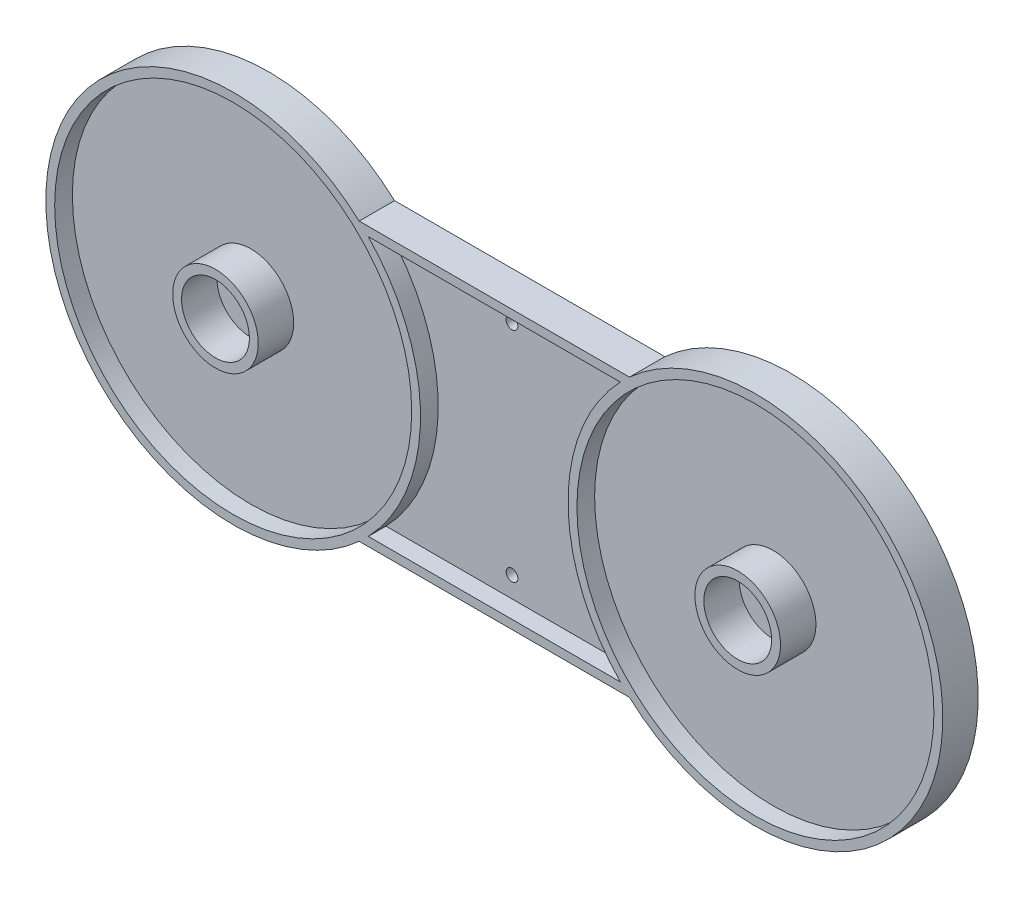
ISO-10303-21;
HEADER;
FILE_DESCRIPTION(('STEP AP214'),'2;1');
FILE_NAME('part.step','',(''),(''),'','','');
FILE_SCHEMA(('AUTOMOTIVE_DESIGN { 1 0 10303 214 1 1 1 1 }'));
ENDSEC;
DATA;
#1=APPLICATION_CONTEXT('core data for automotive mechanical design processes');
#2=APPLICATION_PROTOCOL_DEFINITION('international standard','automotive_design',2000,#1);
#3=PRODUCT_CONTEXT('',#1,'mechanical');
#4=PRODUCT('Part','Part','',(#3));
#5=PRODUCT_RELATED_PRODUCT_CATEGORY('part','',(#4));
#6=PRODUCT_DEFINITION_FORMATION('','',#4);
#7=PRODUCT_DEFINITION_CONTEXT('part definition',#1,'design');
#8=PRODUCT_DEFINITION('design','',#6,#7);
#9=PRODUCT_DEFINITION_SHAPE('','',#8);
#10=(LENGTH_UNIT() NAMED_UNIT(*) SI_UNIT(.MILLI.,.METRE.));
#11=(NAMED_UNIT(*) PLANE_ANGLE_UNIT() SI_UNIT($,.RADIAN.));
#12=(NAMED_UNIT(*) SI_UNIT($,.STERADIAN.) SOLID_ANGLE_UNIT());
#13=UNCERTAINTY_MEASURE_WITH_UNIT(LENGTH_MEASURE(1.E-05),#10,'distance_accuracy_value','');
#14=(GEOMETRIC_REPRESENTATION_CONTEXT(3) GLOBAL_UNCERTAINTY_ASSIGNED_CONTEXT((#13)) GLOBAL_UNIT_ASSIGNED_CONTEXT((#10,
#11,#12)) REPRESENTATION_CONTEXT('',''));
#15=CARTESIAN_POINT('',(0.,0.,0.));
#16=DIRECTION('',(0.,0.,1.));
#17=DIRECTION('',(1.,0.,0.));
#18=AXIS2_PLACEMENT_3D('',#15,#16,#17);
#19=CARTESIAN_POINT('',(44.25,0.,3.));
#20=DIRECTION('',(0.,0.,1.));
#21=DIRECTION('',(1.,0.,0.));
#22=AXIS2_PLACEMENT_3D('',#19,#20,#21);
#23=PLANE('',#22);
#24=DIRECTION('',(-1.,0.,0.));
#25=VECTOR('',#24,1.);
#26=CARTESIAN_POINT('',(0.,22.,3.));
#27=LINE('',#26,#25);
#28=CARTESIAN_POINT('',(21.3575885935972,22.,3.));
#29=VERTEX_POINT('',#28);
#30=CARTESIAN_POINT('',(-21.3575885935972,22.,3.));
#31=VERTEX_POINT('',#30);
#32=EDGE_CURVE('E57',#29,#31,#27,.T.);
#33=ORIENTED_EDGE('',*,*,#32,.T.);
#34=CARTESIAN_POINT('',(-44.25,0.,3.));
#35=DIRECTION('',(0.,0.,1.));
#36=DIRECTION('',(1.,0.,0.));
#37=AXIS2_PLACEMENT_3D('',#34,#35,#36);
#38=CIRCLE('',#37,31.75);
#39=CARTESIAN_POINT('',(-21.3575885935972,-22.,3.));
#40=VERTEX_POINT('',#39);
#41=EDGE_CURVE('E169',#40,#31,#38,.T.);
#42=ORIENTED_EDGE('',*,*,#41,.F.);
#43=DIRECTION('',(1.,0.,0.));
#44=VECTOR('',#43,1.);
#45=CARTESIAN_POINT('',(0.,-22.,3.));
#46=LINE('',#45,#44);
#47=CARTESIAN_POINT('',(21.3575885935972,-22.,3.));
#48=VERTEX_POINT('',#47);
#49=EDGE_CURVE('E137',#40,#48,#46,.T.);
#50=ORIENTED_EDGE('',*,*,#49,.T.);
#51=CARTESIAN_POINT('',(44.25,0.,3.));
#52=DIRECTION('',(0.,0.,1.));
#53=DIRECTION('',(1.,0.,0.));
#54=AXIS2_PLACEMENT_3D('',#51,#52,#53);
#55=CIRCLE('',#54,31.75);
#56=EDGE_CURVE('E62',#29,#48,#55,.T.);
#57=ORIENTED_EDGE('',*,*,#56,.F.);
#58=EDGE_LOOP('',(#33,#42,#50,#57));
#59=FACE_BOUND('',#58,.T.);
#60=CARTESIAN_POINT('',(0.,-18.5,3.));
#61=DIRECTION('',(0.,0.,1.));
#62=DIRECTION('',(1.,0.,0.));
#63=AXIS2_PLACEMENT_3D('',#60,#61,#62);
#64=CIRCLE('',#63,1.);
#65=CARTESIAN_POINT('',(1.,-18.5,3.));
#66=VERTEX_POINT('',#65);
#67=EDGE_CURVE('E198',#66,#66,#64,.T.);
#68=ORIENTED_EDGE('',*,*,#67,.F.);
#69=EDGE_LOOP('',(#68));
#70=FACE_BOUND('',#69,.T.);
#71=CARTESIAN_POINT('',(0.,18.5,3.));
#72=DIRECTION('',(0.,0.,1.));
#73=DIRECTION('',(-1.,0.,0.));
#74=AXIS2_PLACEMENT_3D('',#71,#72,#73);
#75=CIRCLE('',#74,1.);
#76=CARTESIAN_POINT('',(-0.999999999999998,18.5,3.));
#77=VERTEX_POINT('',#76);
#78=EDGE_CURVE('E190',#77,#77,#75,.T.);
#79=ORIENTED_EDGE('',*,*,#78,.F.);
#80=EDGE_LOOP('',(#79));
#81=FACE_BOUND('',#80,.T.);
#82=ADVANCED_FACE('F41',(#59,#70,#81),#23,.T.);
#83=CARTESIAN_POINT('',(44.25,0.,0.));
#84=DIRECTION('',(0.,0.,1.));
#85=DIRECTION('',(1.,0.,0.));
#86=AXIS2_PLACEMENT_3D('',#83,#84,#85);
#87=PLANE('',#86);
#88=CARTESIAN_POINT('',(44.25,0.,0.));
#89=DIRECTION('',(0.,0.,1.));
#90=DIRECTION('',(1.,0.,0.));
#91=AXIS2_PLACEMENT_3D('',#88,#89,#90);
#92=CIRCLE('',#91,31.75);
#93=CARTESIAN_POINT('',(22.9002341933219,-23.5,0.));
#94=VERTEX_POINT('',#93);
#95=CARTESIAN_POINT('',(22.9002341933219,23.5,0.));
#96=VERTEX_POINT('',#95);
#97=EDGE_CURVE('E202',#94,#96,#92,.T.);
#98=ORIENTED_EDGE('',*,*,#97,.F.);
#99=DIRECTION('',(1.,0.,0.));
#100=VECTOR('',#99,1.);
#101=CARTESIAN_POINT('',(-22.9002341933219,-23.5,0.));
#102=LINE('',#101,#100);
#103=CARTESIAN_POINT('',(-22.9002341933219,-23.5,0.));
#104=VERTEX_POINT('',#103);
#105=EDGE_CURVE('E113',#104,#94,#102,.T.);
#106=ORIENTED_EDGE('',*,*,#105,.F.);
#107=CARTESIAN_POINT('',(-44.25,0.,0.));
#108=DIRECTION('',(0.,0.,1.));
#109=DIRECTION('',(1.,0.,0.));
#110=AXIS2_PLACEMENT_3D('',#107,#108,#109);
#111=CIRCLE('',#110,31.75);
#112=CARTESIAN_POINT('',(-22.9002341933219,23.5,0.));
#113=VERTEX_POINT('',#112);
#114=EDGE_CURVE('E211',#113,#104,#111,.T.);
#115=ORIENTED_EDGE('',*,*,#114,.F.);
#116=DIRECTION('',(-1.,0.,0.));
#117=VECTOR('',#116,1.);
#118=CARTESIAN_POINT('',(-22.9002341933219,23.5,0.));
#119=LINE('',#118,#117);
#120=EDGE_CURVE('E208',#96,#113,#119,.T.);
#121=ORIENTED_EDGE('',*,*,#120,.F.);
#122=EDGE_LOOP('',(#98,#106,#115,#121));
#123=FACE_BOUND('',#122,.T.);
#124=CARTESIAN_POINT('',(0.,-18.5,0.));
#125=DIRECTION('',(0.,0.,1.));
#126=DIRECTION('',(1.,0.,0.));
#127=AXIS2_PLACEMENT_3D('',#124,#125,#126);
#128=CIRCLE('',#127,1.);
#129=CARTESIAN_POINT('',(1.,-18.5,0.));
#130=VERTEX_POINT('',#129);
#131=EDGE_CURVE('E194',#130,#130,#128,.T.);
#132=ORIENTED_EDGE('',*,*,#131,.T.);
#133=EDGE_LOOP('',(#132));
#134=FACE_BOUND('',#133,.T.);
#135=CARTESIAN_POINT('',(0.,18.5,0.));
#136=DIRECTION('',(0.,0.,1.));
#137=DIRECTION('',(-1.,0.,0.));
#138=AXIS2_PLACEMENT_3D('',#135,#136,#137);
#139=CIRCLE('',#138,1.);
#140=CARTESIAN_POINT('',(-0.999999999999998,18.5,0.));
#141=VERTEX_POINT('',#140);
#142=EDGE_CURVE('E189',#141,#141,#139,.T.);
#143=ORIENTED_EDGE('',*,*,#142,.T.);
#144=EDGE_LOOP('',(#143));
#145=FACE_BOUND('',#144,.T.);
#146=ADVANCED_FACE('F263',(#123,#134,#145),#87,.F.);
#147=CARTESIAN_POINT('',(44.25,0.,3.));
#148=DIRECTION('',(0.,0.,-1.));
#149=DIRECTION('',(-1.,0.,0.));
#150=AXIS2_PLACEMENT_3D('',#147,#148,#149);
#151=CYLINDRICAL_SURFACE('',#150,31.75);
#152=ORIENTED_EDGE('',*,*,#97,.T.);
#153=DIRECTION('',(0.,0.,-1.));
#154=VECTOR('',#153,1.);
#155=CARTESIAN_POINT('',(22.9002341933219,23.5,3.));
#156=LINE('',#155,#154);
#157=CARTESIAN_POINT('',(22.9002341933219,23.5,6.));
#158=VERTEX_POINT('',#157);
#159=EDGE_CURVE('E123',#158,#96,#156,.T.);
#160=ORIENTED_EDGE('',*,*,#159,.F.);
#161=CARTESIAN_POINT('',(44.25,0.,6.));
#162=DIRECTION('',(0.,0.,1.));
#163=DIRECTION('',(1.,0.,0.));
#164=AXIS2_PLACEMENT_3D('',#161,#162,#163);
#165=CIRCLE('',#164,31.75);
#166=CARTESIAN_POINT('',(22.9002341933219,-23.5,6.));
#167=VERTEX_POINT('',#166);
#168=EDGE_CURVE('E121',#167,#158,#165,.T.);
#169=ORIENTED_EDGE('',*,*,#168,.F.);
#170=DIRECTION('',(0.,0.,-1.));
#171=VECTOR('',#170,1.);
#172=CARTESIAN_POINT('',(22.9002341933219,-23.5,3.));
#173=LINE('',#172,#171);
#174=EDGE_CURVE('E106',#167,#94,#173,.T.);
#175=ORIENTED_EDGE('',*,*,#174,.T.);
#176=EDGE_LOOP('',(#152,#160,#169,#175));
#177=FACE_BOUND('',#176,.T.);
#178=ADVANCED_FACE('F43',(#177),#151,.T.);
#179=CARTESIAN_POINT('',(-22.9002341933219,23.5,3.));
#180=DIRECTION('',(0.,-1.,0.));
#181=DIRECTION('',(1.,0.,0.));
#182=AXIS2_PLACEMENT_3D('',#179,#180,#181);
#183=PLANE('',#182);
#184=ORIENTED_EDGE('',*,*,#120,.T.);
#185=DIRECTION('',(0.,0.,-1.));
#186=VECTOR('',#185,1.);
#187=CARTESIAN_POINT('',(-22.9002341933219,23.5,3.));
#188=LINE('',#187,#186);
#189=CARTESIAN_POINT('',(-22.9002341933219,23.5,6.));
#190=VERTEX_POINT('',#189);
#191=EDGE_CURVE('E218',#190,#113,#188,.T.);
#192=ORIENTED_EDGE('',*,*,#191,.F.);
#193=DIRECTION('',(-1.,0.,0.));
#194=VECTOR('',#193,1.);
#195=CARTESIAN_POINT('',(0.,23.5,6.));
#196=LINE('',#195,#194);
#197=EDGE_CURVE('E128',#158,#190,#196,.T.);
#198=ORIENTED_EDGE('',*,*,#197,.F.);
#199=ORIENTED_EDGE('',*,*,#159,.T.);
#200=EDGE_LOOP('',(#184,#192,#198,#199));
#201=FACE_BOUND('',#200,.T.);
#202=ADVANCED_FACE('F332',(#201),#183,.F.);
#203=CARTESIAN_POINT('',(-44.25,0.,3.));
#204=DIRECTION('',(0.,0.,-1.));
#205=DIRECTION('',(-1.,0.,0.));
#206=AXIS2_PLACEMENT_3D('',#203,#204,#205);
#207=CYLINDRICAL_SURFACE('',#206,31.75);
#208=ORIENTED_EDGE('',*,*,#114,.T.);
#209=DIRECTION('',(0.,0.,-1.));
#210=VECTOR('',#209,1.);
#211=CARTESIAN_POINT('',(-22.9002341933219,-23.5,3.));
#212=LINE('',#211,#210);
#213=CARTESIAN_POINT('',(-22.9002341933219,-23.5,6.));
#214=VERTEX_POINT('',#213);
#215=EDGE_CURVE('E118',#214,#104,#212,.T.);
#216=ORIENTED_EDGE('',*,*,#215,.F.);
#217=CARTESIAN_POINT('',(-44.25,0.,6.));
#218=DIRECTION('',(0.,0.,1.));
#219=DIRECTION('',(1.,0.,0.));
#220=AXIS2_PLACEMENT_3D('',#217,#218,#219);
#221=CIRCLE('',#220,31.75);
#222=EDGE_CURVE('E135',#190,#214,#221,.T.);
#223=ORIENTED_EDGE('',*,*,#222,.F.);
#224=ORIENTED_EDGE('',*,*,#191,.T.);
#225=EDGE_LOOP('',(#208,#216,#223,#224));
#226=FACE_BOUND('',#225,.T.);
#227=ADVANCED_FACE('F318',(#226),#207,.T.);
#228=CARTESIAN_POINT('',(-22.9002341933219,-23.5,3.));
#229=DIRECTION('',(0.,1.,0.));
#230=DIRECTION('',(-1.,0.,0.));
#231=AXIS2_PLACEMENT_3D('',#228,#229,#230);
#232=PLANE('',#231);
#233=ORIENTED_EDGE('',*,*,#105,.T.);
#234=ORIENTED_EDGE('',*,*,#174,.F.);
#235=DIRECTION('',(1.,0.,0.));
#236=VECTOR('',#235,1.);
#237=CARTESIAN_POINT('',(0.,-23.5,6.));
#238=LINE('',#237,#236);
#239=EDGE_CURVE('E111',#214,#167,#238,.T.);
#240=ORIENTED_EDGE('',*,*,#239,.F.);
#241=ORIENTED_EDGE('',*,*,#215,.T.);
#242=EDGE_LOOP('',(#233,#234,#240,#241));
#243=FACE_BOUND('',#242,.T.);
#244=ADVANCED_FACE('F108',(#243),#232,.F.);
#245=CARTESIAN_POINT('',(0.,-18.5,3.));
#246=DIRECTION('',(0.,0.,-1.));
#247=DIRECTION('',(-1.,0.,0.));
#248=AXIS2_PLACEMENT_3D('',#245,#246,#247);
#249=CYLINDRICAL_SURFACE('',#248,1.);
#250=ORIENTED_EDGE('',*,*,#67,.T.);
#251=EDGE_LOOP('',(#250));
#252=FACE_BOUND('',#251,.T.);
#253=ORIENTED_EDGE('',*,*,#131,.F.);
#254=EDGE_LOOP('',(#253));
#255=FACE_BOUND('',#254,.T.);
#256=ADVANCED_FACE('F311',(#252,#255),#249,.F.);
#257=CARTESIAN_POINT('',(0.,18.5,3.));
#258=DIRECTION('',(0.,0.,-1.));
#259=DIRECTION('',(-1.,0.,0.));
#260=AXIS2_PLACEMENT_3D('',#257,#258,#259);
#261=CYLINDRICAL_SURFACE('',#260,1.);
#262=ORIENTED_EDGE('',*,*,#78,.T.);
#263=EDGE_LOOP('',(#262));
#264=FACE_BOUND('',#263,.T.);
#265=ORIENTED_EDGE('',*,*,#142,.F.);
#266=EDGE_LOOP('',(#265));
#267=FACE_BOUND('',#266,.T.);
#268=ADVANCED_FACE('F307',(#264,#267),#261,.F.);
#269=CARTESIAN_POINT('',(-44.25,0.,6.));
#270=DIRECTION('',(0.,0.,-1.));
#271=DIRECTION('',(-1.,0.,0.));
#272=AXIS2_PLACEMENT_3D('',#269,#270,#271);
#273=CYLINDRICAL_SURFACE('',#272,31.75);
#274=ORIENTED_EDGE('',*,*,#41,.T.);
#275=DIRECTION('',(0.,0.,-1.));
#276=VECTOR('',#275,1.);
#277=CARTESIAN_POINT('',(-21.3575885935972,22.,6.));
#278=LINE('',#277,#276);
#279=CARTESIAN_POINT('',(-21.3575885935972,22.,6.));
#280=VERTEX_POINT('',#279);
#281=EDGE_CURVE('E186',#280,#31,#278,.T.);
#282=ORIENTED_EDGE('',*,*,#281,.F.);
#283=CARTESIAN_POINT('',(-21.3575885935972,-22.,6.));
#284=VERTEX_POINT('',#283);
#285=EDGE_CURVE('E150',#284,#280,#221,.T.);
#286=ORIENTED_EDGE('',*,*,#285,.F.);
#287=DIRECTION('',(0.,0.,-1.));
#288=VECTOR('',#287,1.);
#289=CARTESIAN_POINT('',(-21.3575885935972,-22.,6.));
#290=LINE('',#289,#288);
#291=EDGE_CURVE('E166',#284,#40,#290,.T.);
#292=ORIENTED_EDGE('',*,*,#291,.T.);
#293=EDGE_LOOP('',(#274,#282,#286,#292));
#294=FACE_BOUND('',#293,.T.);
#295=ADVANCED_FACE('F304',(#294),#273,.T.);
#296=CARTESIAN_POINT('',(0.,22.,6.));
#297=DIRECTION('',(0.,-1.,0.));
#298=DIRECTION('',(0.,0.,-1.));
#299=AXIS2_PLACEMENT_3D('',#296,#297,#298);
#300=PLANE('',#299);
#301=ORIENTED_EDGE('',*,*,#32,.F.);
#302=DIRECTION('',(0.,0.,-1.));
#303=VECTOR('',#302,1.);
#304=CARTESIAN_POINT('',(21.3575885935972,22.,6.));
#305=LINE('',#304,#303);
#306=CARTESIAN_POINT('',(21.3575885935972,22.,6.));
#307=VERTEX_POINT('',#306);
#308=EDGE_CURVE('E183',#307,#29,#305,.T.);
#309=ORIENTED_EDGE('',*,*,#308,.F.);
#310=DIRECTION('',(-1.,0.,0.));
#311=VECTOR('',#310,1.);
#312=CARTESIAN_POINT('',(0.,22.,6.));
#313=LINE('',#312,#311);
#314=EDGE_CURVE('E154',#307,#280,#313,.T.);
#315=ORIENTED_EDGE('',*,*,#314,.T.);
#316=ORIENTED_EDGE('',*,*,#281,.T.);
#317=EDGE_LOOP('',(#301,#309,#315,#316));
#318=FACE_BOUND('',#317,.T.);
#319=ADVANCED_FACE('F300',(#318),#300,.T.);
#320=CARTESIAN_POINT('',(44.25,0.,6.));
#321=DIRECTION('',(0.,0.,-1.));
#322=DIRECTION('',(-1.,0.,0.));
#323=AXIS2_PLACEMENT_3D('',#320,#321,#322);
#324=CYLINDRICAL_SURFACE('',#323,31.75);
#325=ORIENTED_EDGE('',*,*,#56,.T.);
#326=DIRECTION('',(0.,0.,-1.));
#327=VECTOR('',#326,1.);
#328=CARTESIAN_POINT('',(21.3575885935972,-22.,6.));
#329=LINE('',#328,#327);
#330=CARTESIAN_POINT('',(21.3575885935972,-22.,6.));
#331=VERTEX_POINT('',#330);
#332=EDGE_CURVE('E179',#331,#48,#329,.T.);
#333=ORIENTED_EDGE('',*,*,#332,.F.);
#334=EDGE_CURVE('E130',#307,#331,#165,.T.);
#335=ORIENTED_EDGE('',*,*,#334,.F.);
#336=ORIENTED_EDGE('',*,*,#308,.T.);
#337=EDGE_LOOP('',(#325,#333,#335,#336));
#338=FACE_BOUND('',#337,.T.);
#339=ADVANCED_FACE('F296',(#338),#324,.T.);
#340=CARTESIAN_POINT('',(0.,-22.,6.));
#341=DIRECTION('',(0.,1.,0.));
#342=DIRECTION('',(0.,0.,1.));
#343=AXIS2_PLACEMENT_3D('',#340,#341,#342);
#344=PLANE('',#343);
#345=ORIENTED_EDGE('',*,*,#49,.F.);
#346=ORIENTED_EDGE('',*,*,#291,.F.);
#347=DIRECTION('',(1.,0.,0.));
#348=VECTOR('',#347,1.);
#349=CARTESIAN_POINT('',(0.,-22.,6.));
#350=LINE('',#349,#348);
#351=EDGE_CURVE('E158',#284,#331,#350,.T.);
#352=ORIENTED_EDGE('',*,*,#351,.T.);
#353=ORIENTED_EDGE('',*,*,#332,.T.);
#354=EDGE_LOOP('',(#345,#346,#352,#353));
#355=FACE_BOUND('',#354,.T.);
#356=ADVANCED_FACE('F289',(#355),#344,.T.);
#357=CARTESIAN_POINT('',(-44.25,0.,6.));
#358=DIRECTION('',(0.,0.,-1.));
#359=DIRECTION('',(-1.,0.,0.));
#360=AXIS2_PLACEMENT_3D('',#357,#358,#359);
#361=CYLINDRICAL_SURFACE('',#360,30.25);
#362=CARTESIAN_POINT('',(-44.25,0.,6.));
#363=DIRECTION('',(0.,0.,1.));
#364=DIRECTION('',(1.,0.,0.));
#365=AXIS2_PLACEMENT_3D('',#362,#363,#364);
#366=CIRCLE('',#365,30.25);
#367=CARTESIAN_POINT('',(-14.,0.,6.));
#368=VERTEX_POINT('',#367);
#369=EDGE_CURVE('E149',#368,#368,#366,.T.);
#370=ORIENTED_EDGE('',*,*,#369,.T.);
#371=EDGE_LOOP('',(#370));
#372=FACE_BOUND('',#371,.T.);
#373=CARTESIAN_POINT('',(-44.25,0.,3.));
#374=DIRECTION('',(0.,0.,1.));
#375=DIRECTION('',(1.,0.,0.));
#376=AXIS2_PLACEMENT_3D('',#373,#374,#375);
#377=CIRCLE('',#376,30.25);
#378=CARTESIAN_POINT('',(-14.,0.,3.));
#379=VERTEX_POINT('',#378);
#380=EDGE_CURVE('E228',#379,#379,#377,.F.);
#381=ORIENTED_EDGE('',*,*,#380,.T.);
#382=EDGE_LOOP('',(#381));
#383=FACE_BOUND('',#382,.T.);
#384=ADVANCED_FACE('F283',(#372,#383),#361,.F.);
#385=CARTESIAN_POINT('',(44.25,0.,6.));
#386=DIRECTION('',(0.,0.,-1.));
#387=DIRECTION('',(-1.,0.,0.));
#388=AXIS2_PLACEMENT_3D('',#385,#386,#387);
#389=CYLINDRICAL_SURFACE('',#388,30.25);
#390=CARTESIAN_POINT('',(44.25,0.,6.));
#391=DIRECTION('',(0.,0.,1.));
#392=DIRECTION('',(1.,0.,0.));
#393=AXIS2_PLACEMENT_3D('',#390,#391,#392);
#394=CIRCLE('',#393,30.25);
#395=CARTESIAN_POINT('',(74.5,0.,6.));
#396=VERTEX_POINT('',#395);
#397=EDGE_CURVE('E162',#396,#396,#394,.T.);
#398=ORIENTED_EDGE('',*,*,#397,.T.);
#399=EDGE_LOOP('',(#398));
#400=FACE_BOUND('',#399,.T.);
#401=CARTESIAN_POINT('',(44.25,0.,3.));
#402=DIRECTION('',(0.,0.,1.));
#403=DIRECTION('',(1.,0.,0.));
#404=AXIS2_PLACEMENT_3D('',#401,#402,#403);
#405=CIRCLE('',#404,30.25);
#406=CARTESIAN_POINT('',(74.5,0.,3.));
#407=VERTEX_POINT('',#406);
#408=EDGE_CURVE('E224',#407,#407,#405,.F.);
#409=ORIENTED_EDGE('',*,*,#408,.T.);
#410=EDGE_LOOP('',(#409));
#411=FACE_BOUND('',#410,.T.);
#412=ADVANCED_FACE('F274',(#400,#411),#389,.F.);
#413=CARTESIAN_POINT('',(0.,0.,6.));
#414=DIRECTION('',(0.,0.,1.));
#415=DIRECTION('',(1.,0.,0.));
#416=AXIS2_PLACEMENT_3D('',#413,#414,#415);
#417=PLANE('',#416);
#418=ORIENTED_EDGE('',*,*,#239,.T.);
#419=ORIENTED_EDGE('',*,*,#168,.T.);
#420=ORIENTED_EDGE('',*,*,#197,.T.);
#421=ORIENTED_EDGE('',*,*,#222,.T.);
#422=EDGE_LOOP('',(#418,#419,#420,#421));
#423=FACE_BOUND('',#422,.T.);
#424=ORIENTED_EDGE('',*,*,#369,.F.);
#425=EDGE_LOOP('',(#424));
#426=FACE_BOUND('',#425,.T.);
#427=ORIENTED_EDGE('',*,*,#285,.T.);
#428=ORIENTED_EDGE('',*,*,#314,.F.);
#429=ORIENTED_EDGE('',*,*,#334,.T.);
#430=ORIENTED_EDGE('',*,*,#351,.F.);
#431=EDGE_LOOP('',(#427,#428,#429,#430));
#432=FACE_BOUND('',#431,.T.);
#433=ORIENTED_EDGE('',*,*,#397,.F.);
#434=EDGE_LOOP('',(#433));
#435=FACE_BOUND('',#434,.T.);
#436=ADVANCED_FACE('F132',(#423,#426,#432,#435),#417,.T.);
#437=CARTESIAN_POINT('',(44.25,0.,3.));
#438=DIRECTION('',(0.,0.,1.));
#439=DIRECTION('',(-1.,0.,0.));
#440=AXIS2_PLACEMENT_3D('',#437,#438,#439);
#441=CIRCLE('',#440,7.25);
#442=CARTESIAN_POINT('',(37.,0.,3.));
#443=VERTEX_POINT('',#442);
#444=EDGE_CURVE('E279',#443,#443,#441,.T.);
#445=ORIENTED_EDGE('',*,*,#444,.F.);
#446=EDGE_LOOP('',(#445));
#447=FACE_BOUND('',#446,.T.);
#448=ORIENTED_EDGE('',*,*,#408,.F.);
#449=EDGE_LOOP('',(#448));
#450=FACE_BOUND('',#449,.T.);
#451=ADVANCED_FACE('F257',(#447,#450),#23,.T.);
#452=CARTESIAN_POINT('',(-44.25,0.,3.));
#453=DIRECTION('',(0.,0.,1.));
#454=DIRECTION('',(1.,0.,0.));
#455=AXIS2_PLACEMENT_3D('',#452,#453,#454);
#456=CIRCLE('',#455,7.25);
#457=CARTESIAN_POINT('',(-37.,0.,3.));
#458=VERTEX_POINT('',#457);
#459=EDGE_CURVE('E142',#458,#458,#456,.T.);
#460=ORIENTED_EDGE('',*,*,#459,.F.);
#461=EDGE_LOOP('',(#460));
#462=FACE_BOUND('',#461,.T.);
#463=ORIENTED_EDGE('',*,*,#380,.F.);
#464=EDGE_LOOP('',(#463));
#465=FACE_BOUND('',#464,.T.);
#466=ADVANCED_FACE('F241',(#462,#465),#23,.T.);
#467=CARTESIAN_POINT('',(-44.25,0.,9.));
#468=DIRECTION('',(0.,0.,1.));
#469=DIRECTION('',(1.,0.,0.));
#470=AXIS2_PLACEMENT_3D('',#467,#468,#469);
#471=PLANE('',#470);
#472=CARTESIAN_POINT('',(-44.25,0.,9.));
#473=DIRECTION('',(0.,0.,1.));
#474=DIRECTION('',(1.,0.,0.));
#475=AXIS2_PLACEMENT_3D('',#472,#473,#474);
#476=CIRCLE('',#475,7.25);
#477=CARTESIAN_POINT('',(-37.,0.,9.));
#478=VERTEX_POINT('',#477);
#479=EDGE_CURVE('E173',#478,#478,#476,.T.);
#480=ORIENTED_EDGE('',*,*,#479,.T.);
#481=EDGE_LOOP('',(#480));
#482=FACE_BOUND('',#481,.T.);
#483=CARTESIAN_POINT('',(-44.25,0.,9.));
#484=DIRECTION('',(0.,0.,1.));
#485=DIRECTION('',(1.,0.,0.));
#486=AXIS2_PLACEMENT_3D('',#483,#484,#485);
#487=CIRCLE('',#486,5.75);
#488=CARTESIAN_POINT('',(-38.5,0.,9.));
#489=VERTEX_POINT('',#488);
#490=EDGE_CURVE('E483',#489,#489,#487,.T.);
#491=ORIENTED_EDGE('',*,*,#490,.F.);
#492=EDGE_LOOP('',(#491));
#493=FACE_BOUND('',#492,.T.);
#494=ADVANCED_FACE('F256',(#482,#493),#471,.T.);
#495=CARTESIAN_POINT('',(-44.25,0.,9.));
#496=DIRECTION('',(0.,0.,-1.));
#497=DIRECTION('',(-1.,0.,0.));
#498=AXIS2_PLACEMENT_3D('',#495,#496,#497);
#499=CYLINDRICAL_SURFACE('',#498,7.25);
#500=ORIENTED_EDGE('',*,*,#479,.F.);
#501=EDGE_LOOP('',(#500));
#502=FACE_BOUND('',#501,.T.);
#503=ORIENTED_EDGE('',*,*,#459,.T.);
#504=EDGE_LOOP('',(#503));
#505=FACE_BOUND('',#504,.T.);
#506=ADVANCED_FACE('F250',(#502,#505),#499,.T.);
#507=CARTESIAN_POINT('',(-44.25,0.,9.));
#508=DIRECTION('',(0.,0.,-1.));
#509=DIRECTION('',(-1.,0.,0.));
#510=AXIS2_PLACEMENT_3D('',#507,#508,#509);
#511=CYLINDRICAL_SURFACE('',#510,5.75);
#512=ORIENTED_EDGE('',*,*,#490,.T.);
#513=EDGE_LOOP('',(#512));
#514=FACE_BOUND('',#513,.T.);
#515=CARTESIAN_POINT('',(-44.25,0.,3.));
#516=DIRECTION('',(0.,0.,1.));
#517=DIRECTION('',(1.,0.,0.));
#518=AXIS2_PLACEMENT_3D('',#515,#516,#517);
#519=CIRCLE('',#518,5.75);
#520=CARTESIAN_POINT('',(-38.5,0.,3.));
#521=VERTEX_POINT('',#520);
#522=EDGE_CURVE('E50',#521,#521,#519,.F.);
#523=ORIENTED_EDGE('',*,*,#522,.T.);
#524=EDGE_LOOP('',(#523));
#525=FACE_BOUND('',#524,.T.);
#526=ADVANCED_FACE('F235',(#514,#525),#511,.F.);
#527=ORIENTED_EDGE('',*,*,#522,.F.);
#528=EDGE_LOOP('',(#527));
#529=FACE_BOUND('',#528,.T.);
#530=ADVANCED_FACE('F237',(#529),#23,.T.);
#531=CARTESIAN_POINT('',(44.25,0.,9.));
#532=DIRECTION('',(0.,0.,-1.));
#533=DIRECTION('',(-1.,0.,0.));
#534=AXIS2_PLACEMENT_3D('',#531,#532,#533);
#535=PLANE('',#534);
#536=CARTESIAN_POINT('',(44.25,0.,9.));
#537=DIRECTION('',(0.,0.,1.));
#538=DIRECTION('',(-1.,0.,0.));
#539=AXIS2_PLACEMENT_3D('',#536,#537,#538);
#540=CIRCLE('',#539,7.25);
#541=CARTESIAN_POINT('',(37.,0.,9.));
#542=VERTEX_POINT('',#541);
#543=EDGE_CURVE('E478',#542,#542,#540,.T.);
#544=ORIENTED_EDGE('',*,*,#543,.T.);
#545=EDGE_LOOP('',(#544));
#546=FACE_BOUND('',#545,.T.);
#547=CARTESIAN_POINT('',(44.25,0.,9.));
#548=DIRECTION('',(0.,0.,1.));
#549=DIRECTION('',(-1.,0.,0.));
#550=AXIS2_PLACEMENT_3D('',#547,#548,#549);
#551=CIRCLE('',#550,5.75);
#552=CARTESIAN_POINT('',(38.5,0.,9.));
#553=VERTEX_POINT('',#552);
#554=EDGE_CURVE('E472',#553,#553,#551,.T.);
#555=ORIENTED_EDGE('',*,*,#554,.F.);
#556=EDGE_LOOP('',(#555));
#557=FACE_BOUND('',#556,.T.);
#558=ADVANCED_FACE('F239',(#546,#557),#535,.F.);
#559=CARTESIAN_POINT('',(44.25,0.,9.));
#560=DIRECTION('',(0.,0.,-1.));
#561=DIRECTION('',(-1.,0.,0.));
#562=AXIS2_PLACEMENT_3D('',#559,#560,#561);
#563=CYLINDRICAL_SURFACE('',#562,7.25);
#564=ORIENTED_EDGE('',*,*,#543,.F.);
#565=EDGE_LOOP('',(#564));
#566=FACE_BOUND('',#565,.T.);
#567=ORIENTED_EDGE('',*,*,#444,.T.);
#568=EDGE_LOOP('',(#567));
#569=FACE_BOUND('',#568,.T.);
#570=ADVANCED_FACE('F247',(#566,#569),#563,.T.);
#571=CARTESIAN_POINT('',(44.25,0.,9.));
#572=DIRECTION('',(0.,0.,-1.));
#573=DIRECTION('',(-1.,0.,0.));
#574=AXIS2_PLACEMENT_3D('',#571,#572,#573);
#575=CYLINDRICAL_SURFACE('',#574,5.75);
#576=ORIENTED_EDGE('',*,*,#554,.T.);
#577=EDGE_LOOP('',(#576));
#578=FACE_BOUND('',#577,.T.);
#579=CARTESIAN_POINT('',(44.25,0.,3.));
#580=DIRECTION('',(0.,0.,1.));
#581=DIRECTION('',(1.,0.,0.));
#582=AXIS2_PLACEMENT_3D('',#579,#580,#581);
#583=CIRCLE('',#582,5.75);
#584=CARTESIAN_POINT('',(50.,0.,3.));
#585=VERTEX_POINT('',#584);
#586=EDGE_CURVE('E11',#585,#585,#583,.F.);
#587=ORIENTED_EDGE('',*,*,#586,.T.);
#588=EDGE_LOOP('',(#587));
#589=FACE_BOUND('',#588,.T.);
#590=ADVANCED_FACE('F260',(#578,#589),#575,.F.);
#591=ORIENTED_EDGE('',*,*,#586,.F.);
#592=EDGE_LOOP('',(#591));
#593=FACE_BOUND('',#592,.T.);
#594=ADVANCED_FACE('F242',(#593),#23,.T.);
#595=CLOSED_SHELL('',(#82,#146,#178,#202,#227,#244,#256,#268,#295,#319,#339,#356,#384,#412,#436,
#451,#466,#494,#506,#526,#530,#558,#570,#590,#594));
#596=MANIFOLD_SOLID_BREP('B2',#595);
#597=ADVANCED_BREP_SHAPE_REPRESENTATION('',(#18,#596),#14);
#598=SHAPE_DEFINITION_REPRESENTATION(#9,#597);
ENDSEC;
END-ISO-10303-21;
